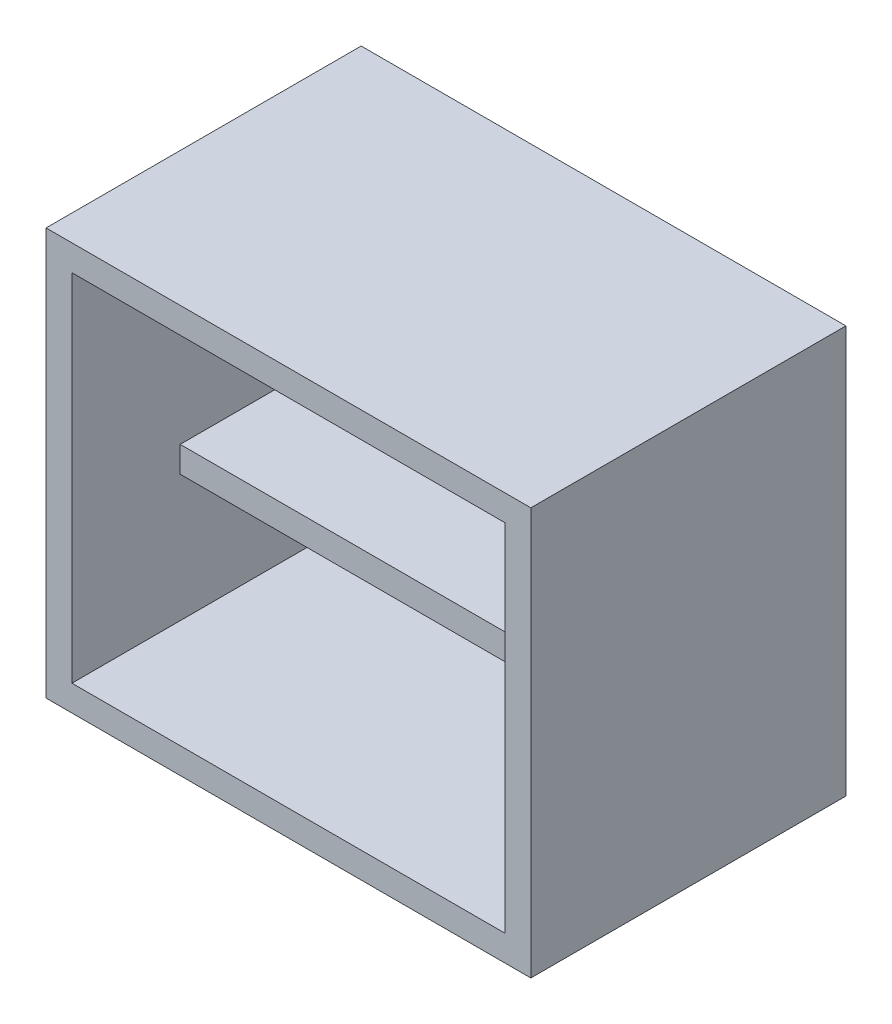
ISO-10303-21;
HEADER;
FILE_DESCRIPTION(('STEP AP214'),'2;1');
FILE_NAME('part.step','',(''),(''),'','','');
FILE_SCHEMA(('AUTOMOTIVE_DESIGN { 1 0 10303 214 1 1 1 1 }'));
ENDSEC;
DATA;
#1=APPLICATION_CONTEXT('core data for automotive mechanical design processes');
#2=APPLICATION_PROTOCOL_DEFINITION('international standard','automotive_design',2000,#1);
#3=PRODUCT_CONTEXT('',#1,'mechanical');
#4=PRODUCT('Part','Part','',(#3));
#5=PRODUCT_RELATED_PRODUCT_CATEGORY('part','',(#4));
#6=PRODUCT_DEFINITION_FORMATION('','',#4);
#7=PRODUCT_DEFINITION_CONTEXT('part definition',#1,'design');
#8=PRODUCT_DEFINITION('design','',#6,#7);
#9=PRODUCT_DEFINITION_SHAPE('','',#8);
#10=(LENGTH_UNIT() NAMED_UNIT(*) SI_UNIT(.MILLI.,.METRE.));
#11=(NAMED_UNIT(*) PLANE_ANGLE_UNIT() SI_UNIT($,.RADIAN.));
#12=(NAMED_UNIT(*) SI_UNIT($,.STERADIAN.) SOLID_ANGLE_UNIT());
#13=UNCERTAINTY_MEASURE_WITH_UNIT(LENGTH_MEASURE(1.E-05),#10,'distance_accuracy_value','');
#14=(GEOMETRIC_REPRESENTATION_CONTEXT(3) GLOBAL_UNCERTAINTY_ASSIGNED_CONTEXT((#13)) GLOBAL_UNIT_ASSIGNED_CONTEXT((#10,
#11,#12)) REPRESENTATION_CONTEXT('',''));
#15=CARTESIAN_POINT('',(0.,0.,0.));
#16=DIRECTION('',(0.,0.,1.));
#17=DIRECTION('',(1.,0.,0.));
#18=AXIS2_PLACEMENT_3D('',#15,#16,#17);
#19=CARTESIAN_POINT('',(0.,110.5,0.));
#20=DIRECTION('',(0.,1.,0.));
#21=DIRECTION('',(0.,0.,1.));
#22=AXIS2_PLACEMENT_3D('',#19,#20,#21);
#23=PLANE('',#22);
#24=DIRECTION('',(0.,0.,1.));
#25=VECTOR('',#24,1.);
#26=CARTESIAN_POINT('',(-134.,110.5,-97.5));
#27=LINE('',#26,#25);
#28=CARTESIAN_POINT('',(-134.,110.5,-97.5));
#29=VERTEX_POINT('',#28);
#30=CARTESIAN_POINT('',(-134.,110.5,30.5));
#31=VERTEX_POINT('',#30);
#32=EDGE_CURVE('E182',#29,#31,#27,.T.);
#33=ORIENTED_EDGE('',*,*,#32,.T.);
#34=DIRECTION('',(1.,0.,0.));
#35=VECTOR('',#34,1.);
#36=CARTESIAN_POINT('',(-134.,110.5,30.5));
#37=LINE('',#36,#35);
#38=CARTESIAN_POINT('',(134.,110.5,30.5));
#39=VERTEX_POINT('',#38);
#40=EDGE_CURVE('E185',#31,#39,#37,.T.);
#41=ORIENTED_EDGE('',*,*,#40,.T.);
#42=DIRECTION('',(0.,0.,-1.));
#43=VECTOR('',#42,1.);
#44=CARTESIAN_POINT('',(134.,110.5,-97.5));
#45=LINE('',#44,#43);
#46=CARTESIAN_POINT('',(134.,110.5,-97.5));
#47=VERTEX_POINT('',#46);
#48=EDGE_CURVE('E189',#39,#47,#45,.T.);
#49=ORIENTED_EDGE('',*,*,#48,.T.);
#50=DIRECTION('',(-1.,0.,0.));
#51=VECTOR('',#50,1.);
#52=CARTESIAN_POINT('',(-134.,110.5,-97.5));
#53=LINE('',#52,#51);
#54=EDGE_CURVE('E192',#47,#29,#53,.T.);
#55=ORIENTED_EDGE('',*,*,#54,.T.);
#56=EDGE_LOOP('',(#33,#41,#49,#55));
#57=FACE_BOUND('',#56,.T.);
#58=DIRECTION('',(-1.,0.,0.));
#59=VECTOR('',#58,1.);
#60=CARTESIAN_POINT('',(31.3688182321278,110.5,-81.9869785387026));
#61=LINE('',#60,#59);
#62=CARTESIAN_POINT('',(31.3688182321278,110.5,-81.9869785387026));
#63=VERTEX_POINT('',#62);
#64=CARTESIAN_POINT('',(-9.63118176787223,110.5,-81.9869785387026));
#65=VERTEX_POINT('',#64);
#66=EDGE_CURVE('E499',#63,#65,#61,.T.);
#67=ORIENTED_EDGE('',*,*,#66,.F.);
#68=DIRECTION('',(0.,0.,-1.));
#69=VECTOR('',#68,1.);
#70=CARTESIAN_POINT('',(31.3688182321278,110.5,-81.9869785387026));
#71=LINE('',#70,#69);
#72=CARTESIAN_POINT('',(31.3688182321278,110.5,-46.9869785387026));
#73=VERTEX_POINT('',#72);
#74=EDGE_CURVE('E173',#73,#63,#71,.T.);
#75=ORIENTED_EDGE('',*,*,#74,.F.);
#76=DIRECTION('',(1.,0.,0.));
#77=VECTOR('',#76,1.);
#78=CARTESIAN_POINT('',(31.3688182321278,110.5,-46.9869785387026));
#79=LINE('',#78,#77);
#80=CARTESIAN_POINT('',(-9.63118176787223,110.5,-46.9869785387026));
#81=VERTEX_POINT('',#80);
#82=EDGE_CURVE('E169',#81,#73,#79,.T.);
#83=ORIENTED_EDGE('',*,*,#82,.F.);
#84=DIRECTION('',(0.,0.,1.));
#85=VECTOR('',#84,1.);
#86=CARTESIAN_POINT('',(-9.63118176787223,110.5,-81.9869785387026));
#87=LINE('',#86,#85);
#88=EDGE_CURVE('E496',#65,#81,#87,.T.);
#89=ORIENTED_EDGE('',*,*,#88,.F.);
#90=EDGE_LOOP('',(#67,#75,#83,#89));
#91=FACE_BOUND('',#90,.T.);
#92=ADVANCED_FACE('F37',(#57,#91),#23,.T.);
#93=CARTESIAN_POINT('',(0.,16.,0.));
#94=DIRECTION('',(0.,-1.,0.));
#95=DIRECTION('',(0.,0.,-1.));
#96=AXIS2_PLACEMENT_3D('',#93,#94,#95);
#97=PLANE('',#96);
#98=DIRECTION('',(0.,0.,1.));
#99=VECTOR('',#98,1.);
#100=CARTESIAN_POINT('',(134.,16.,-97.5));
#101=LINE('',#100,#99);
#102=CARTESIAN_POINT('',(134.,16.,-97.5));
#103=VERTEX_POINT('',#102);
#104=CARTESIAN_POINT('',(134.,16.,97.5));
#105=VERTEX_POINT('',#104);
#106=EDGE_CURVE('E218',#103,#105,#101,.T.);
#107=ORIENTED_EDGE('',*,*,#106,.F.);
#108=DIRECTION('',(-1.,0.,0.));
#109=VECTOR('',#108,1.);
#110=CARTESIAN_POINT('',(-150.,16.,-97.5));
#111=LINE('',#110,#109);
#112=CARTESIAN_POINT('',(-134.,16.,-97.5));
#113=VERTEX_POINT('',#112);
#114=EDGE_CURVE('E248',#103,#113,#111,.T.);
#115=ORIENTED_EDGE('',*,*,#114,.T.);
#116=DIRECTION('',(0.,0.,-1.));
#117=VECTOR('',#116,1.);
#118=CARTESIAN_POINT('',(-134.,16.,-97.5));
#119=LINE('',#118,#117);
#120=CARTESIAN_POINT('',(-134.,16.,97.5));
#121=VERTEX_POINT('',#120);
#122=EDGE_CURVE('E234',#121,#113,#119,.T.);
#123=ORIENTED_EDGE('',*,*,#122,.F.);
#124=DIRECTION('',(1.,0.,0.));
#125=VECTOR('',#124,1.);
#126=CARTESIAN_POINT('',(-150.,16.,97.5));
#127=LINE('',#126,#125);
#128=EDGE_CURVE('E251',#121,#105,#127,.T.);
#129=ORIENTED_EDGE('',*,*,#128,.T.);
#130=EDGE_LOOP('',(#107,#115,#123,#129));
#131=FACE_BOUND('',#130,.T.);
#132=ADVANCED_FACE('F305',(#131),#97,.F.);
#133=CARTESIAN_POINT('',(150.,16.,97.5));
#134=DIRECTION('',(-1.,0.,0.));
#135=DIRECTION('',(0.,0.,1.));
#136=AXIS2_PLACEMENT_3D('',#133,#134,#135);
#137=PLANE('',#136);
#138=DIRECTION('',(0.,0.,-1.));
#139=VECTOR('',#138,1.);
#140=CARTESIAN_POINT('',(150.,0.,97.5));
#141=LINE('',#140,#139);
#142=CARTESIAN_POINT('',(150.,0.,97.5));
#143=VERTEX_POINT('',#142);
#144=CARTESIAN_POINT('',(150.,0.,-97.5));
#145=VERTEX_POINT('',#144);
#146=EDGE_CURVE('E247',#143,#145,#141,.T.);
#147=ORIENTED_EDGE('',*,*,#146,.T.);
#148=DIRECTION('',(0.,-1.,0.));
#149=VECTOR('',#148,1.);
#150=CARTESIAN_POINT('',(150.,16.,-97.5));
#151=LINE('',#150,#149);
#152=CARTESIAN_POINT('',(150.,252.,-97.5));
#153=VERTEX_POINT('',#152);
#154=EDGE_CURVE('E11',#153,#145,#151,.T.);
#155=ORIENTED_EDGE('',*,*,#154,.F.);
#156=DIRECTION('',(0.,0.,-1.));
#157=VECTOR('',#156,1.);
#158=CARTESIAN_POINT('',(150.,252.,-97.5));
#159=LINE('',#158,#157);
#160=CARTESIAN_POINT('',(150.,252.,97.5));
#161=VERTEX_POINT('',#160);
#162=EDGE_CURVE('E212',#161,#153,#159,.T.);
#163=ORIENTED_EDGE('',*,*,#162,.F.);
#164=DIRECTION('',(0.,-1.,0.));
#165=VECTOR('',#164,1.);
#166=CARTESIAN_POINT('',(150.,16.,97.5));
#167=LINE('',#166,#165);
#168=EDGE_CURVE('E254',#161,#143,#167,.T.);
#169=ORIENTED_EDGE('',*,*,#168,.T.);
#170=EDGE_LOOP('',(#147,#155,#163,#169));
#171=FACE_BOUND('',#170,.T.);
#172=ADVANCED_FACE('F39',(#171),#137,.F.);
#173=CARTESIAN_POINT('',(-150.,16.,-97.5));
#174=DIRECTION('',(0.,0.,1.));
#175=DIRECTION('',(1.,0.,0.));
#176=AXIS2_PLACEMENT_3D('',#173,#174,#175);
#177=PLANE('',#176);
#178=DIRECTION('',(-1.,0.,0.));
#179=VECTOR('',#178,1.);
#180=CARTESIAN_POINT('',(-134.,94.5,-97.5));
#181=LINE('',#180,#179);
#182=CARTESIAN_POINT('',(134.,94.5,-97.5));
#183=VERTEX_POINT('',#182);
#184=CARTESIAN_POINT('',(-134.,94.5,-97.5));
#185=VERTEX_POINT('',#184);
#186=EDGE_CURVE('E186',#183,#185,#181,.T.);
#187=ORIENTED_EDGE('',*,*,#186,.T.);
#188=DIRECTION('',(0.,-1.,0.));
#189=VECTOR('',#188,1.);
#190=CARTESIAN_POINT('',(-134.,236.,-97.5));
#191=LINE('',#190,#189);
#192=EDGE_CURVE('E238',#185,#113,#191,.T.);
#193=ORIENTED_EDGE('',*,*,#192,.T.);
#194=ORIENTED_EDGE('',*,*,#114,.F.);
#195=DIRECTION('',(0.,-1.,0.));
#196=VECTOR('',#195,1.);
#197=CARTESIAN_POINT('',(134.,236.,-97.5));
#198=LINE('',#197,#196);
#199=EDGE_CURVE('E231',#183,#103,#198,.T.);
#200=ORIENTED_EDGE('',*,*,#199,.F.);
#201=EDGE_LOOP('',(#187,#193,#194,#200));
#202=FACE_BOUND('',#201,.T.);
#203=DIRECTION('',(0.,-1.,0.));
#204=VECTOR('',#203,1.);
#205=CARTESIAN_POINT('',(-150.,16.,-97.5));
#206=LINE('',#205,#204);
#207=CARTESIAN_POINT('',(-150.,252.,-97.5));
#208=VERTEX_POINT('',#207);
#209=CARTESIAN_POINT('',(-150.,0.,-97.5));
#210=VERTEX_POINT('',#209);
#211=EDGE_CURVE('E45',#208,#210,#206,.T.);
#212=ORIENTED_EDGE('',*,*,#211,.F.);
#213=DIRECTION('',(-1.,0.,0.));
#214=VECTOR('',#213,1.);
#215=CARTESIAN_POINT('',(-150.,252.,-97.5));
#216=LINE('',#215,#214);
#217=EDGE_CURVE('E215',#153,#208,#216,.T.);
#218=ORIENTED_EDGE('',*,*,#217,.F.);
#219=ORIENTED_EDGE('',*,*,#154,.T.);
#220=DIRECTION('',(-1.,0.,0.));
#221=VECTOR('',#220,1.);
#222=CARTESIAN_POINT('',(-150.,0.,-97.5));
#223=LINE('',#222,#221);
#224=EDGE_CURVE('E257',#145,#210,#223,.T.);
#225=ORIENTED_EDGE('',*,*,#224,.T.);
#226=EDGE_LOOP('',(#212,#218,#219,#225));
#227=FACE_BOUND('',#226,.T.);
#228=DIRECTION('',(-1.,0.,0.));
#229=VECTOR('',#228,1.);
#230=CARTESIAN_POINT('',(-150.,236.,-97.5));
#231=LINE('',#230,#229);
#232=CARTESIAN_POINT('',(134.,236.,-97.5));
#233=VERTEX_POINT('',#232);
#234=CARTESIAN_POINT('',(-134.,236.,-97.5));
#235=VERTEX_POINT('',#234);
#236=EDGE_CURVE('E209',#233,#235,#231,.T.);
#237=ORIENTED_EDGE('',*,*,#236,.T.);
#238=EDGE_CURVE('E241',#235,#29,#191,.T.);
#239=ORIENTED_EDGE('',*,*,#238,.T.);
#240=ORIENTED_EDGE('',*,*,#54,.F.);
#241=EDGE_CURVE('E232',#233,#47,#198,.T.);
#242=ORIENTED_EDGE('',*,*,#241,.F.);
#243=EDGE_LOOP('',(#237,#239,#240,#242));
#244=FACE_BOUND('',#243,.T.);
#245=ADVANCED_FACE('F284',(#202,#227,#244),#177,.F.);
#246=CARTESIAN_POINT('',(-150.,16.,97.5));
#247=DIRECTION('',(1.,0.,0.));
#248=DIRECTION('',(0.,0.,-1.));
#249=AXIS2_PLACEMENT_3D('',#246,#247,#248);
#250=PLANE('',#249);
#251=DIRECTION('',(0.,0.,1.));
#252=VECTOR('',#251,1.);
#253=CARTESIAN_POINT('',(-150.,0.,97.5));
#254=LINE('',#253,#252);
#255=CARTESIAN_POINT('',(-150.,0.,97.5));
#256=VERTEX_POINT('',#255);
#257=EDGE_CURVE('E259',#210,#256,#254,.T.);
#258=ORIENTED_EDGE('',*,*,#257,.T.);
#259=DIRECTION('',(0.,-1.,0.));
#260=VECTOR('',#259,1.);
#261=CARTESIAN_POINT('',(-150.,16.,97.5));
#262=LINE('',#261,#260);
#263=CARTESIAN_POINT('',(-150.,252.,97.5));
#264=VERTEX_POINT('',#263);
#265=EDGE_CURVE('E264',#264,#256,#262,.T.);
#266=ORIENTED_EDGE('',*,*,#265,.F.);
#267=DIRECTION('',(0.,0.,1.));
#268=VECTOR('',#267,1.);
#269=CARTESIAN_POINT('',(-150.,252.,-97.5));
#270=LINE('',#269,#268);
#271=EDGE_CURVE('E205',#208,#264,#270,.T.);
#272=ORIENTED_EDGE('',*,*,#271,.F.);
#273=ORIENTED_EDGE('',*,*,#211,.T.);
#274=EDGE_LOOP('',(#258,#266,#272,#273));
#275=FACE_BOUND('',#274,.T.);
#276=ADVANCED_FACE('F270',(#275),#250,.F.);
#277=CARTESIAN_POINT('',(-150.,16.,97.5));
#278=DIRECTION('',(0.,0.,-1.));
#279=DIRECTION('',(-1.,0.,0.));
#280=AXIS2_PLACEMENT_3D('',#277,#278,#279);
#281=PLANE('',#280);
#282=DIRECTION('',(0.,-1.,0.));
#283=VECTOR('',#282,1.);
#284=CARTESIAN_POINT('',(-134.,236.,97.5));
#285=LINE('',#284,#283);
#286=CARTESIAN_POINT('',(-134.,236.,97.5));
#287=VERTEX_POINT('',#286);
#288=EDGE_CURVE('E244',#287,#121,#285,.T.);
#289=ORIENTED_EDGE('',*,*,#288,.F.);
#290=DIRECTION('',(1.,0.,0.));
#291=VECTOR('',#290,1.);
#292=CARTESIAN_POINT('',(-150.,236.,97.5));
#293=LINE('',#292,#291);
#294=CARTESIAN_POINT('',(134.,236.,97.5));
#295=VERTEX_POINT('',#294);
#296=EDGE_CURVE('E204',#287,#295,#293,.T.);
#297=ORIENTED_EDGE('',*,*,#296,.T.);
#298=DIRECTION('',(0.,-1.,0.));
#299=VECTOR('',#298,1.);
#300=CARTESIAN_POINT('',(134.,236.,97.5));
#301=LINE('',#300,#299);
#302=EDGE_CURVE('E226',#295,#105,#301,.T.);
#303=ORIENTED_EDGE('',*,*,#302,.T.);
#304=ORIENTED_EDGE('',*,*,#128,.F.);
#305=EDGE_LOOP('',(#289,#297,#303,#304));
#306=FACE_BOUND('',#305,.T.);
#307=DIRECTION('',(1.,0.,0.));
#308=VECTOR('',#307,1.);
#309=CARTESIAN_POINT('',(-150.,0.,97.5));
#310=LINE('',#309,#308);
#311=EDGE_CURVE('E252',#256,#143,#310,.T.);
#312=ORIENTED_EDGE('',*,*,#311,.T.);
#313=ORIENTED_EDGE('',*,*,#168,.F.);
#314=DIRECTION('',(1.,0.,0.));
#315=VECTOR('',#314,1.);
#316=CARTESIAN_POINT('',(-150.,252.,97.5));
#317=LINE('',#316,#315);
#318=EDGE_CURVE('E208',#264,#161,#317,.T.);
#319=ORIENTED_EDGE('',*,*,#318,.F.);
#320=ORIENTED_EDGE('',*,*,#265,.T.);
#321=EDGE_LOOP('',(#312,#313,#319,#320));
#322=FACE_BOUND('',#321,.T.);
#323=ADVANCED_FACE('F278',(#306,#322),#281,.F.);
#324=CARTESIAN_POINT('',(0.,0.,0.));
#325=DIRECTION('',(0.,-1.,0.));
#326=DIRECTION('',(0.,0.,-1.));
#327=AXIS2_PLACEMENT_3D('',#324,#325,#326);
#328=PLANE('',#327);
#329=ORIENTED_EDGE('',*,*,#146,.F.);
#330=ORIENTED_EDGE('',*,*,#311,.F.);
#331=ORIENTED_EDGE('',*,*,#257,.F.);
#332=ORIENTED_EDGE('',*,*,#224,.F.);
#333=EDGE_LOOP('',(#329,#330,#331,#332));
#334=FACE_BOUND('',#333,.T.);
#335=ADVANCED_FACE('F276',(#334),#328,.T.);
#336=CARTESIAN_POINT('',(-134.,236.,-97.5));
#337=DIRECTION('',(-1.,0.,0.));
#338=DIRECTION('',(0.,0.,1.));
#339=AXIS2_PLACEMENT_3D('',#336,#337,#338);
#340=PLANE('',#339);
#341=DIRECTION('',(0.,-1.,0.));
#342=VECTOR('',#341,1.);
#343=CARTESIAN_POINT('',(-134.,110.5,30.5));
#344=LINE('',#343,#342);
#345=CARTESIAN_POINT('',(-134.,94.5,30.5));
#346=VERTEX_POINT('',#345);
#347=EDGE_CURVE('E60',#31,#346,#344,.T.);
#348=ORIENTED_EDGE('',*,*,#347,.F.);
#349=ORIENTED_EDGE('',*,*,#32,.F.);
#350=ORIENTED_EDGE('',*,*,#238,.F.);
#351=DIRECTION('',(0.,0.,-1.));
#352=VECTOR('',#351,1.);
#353=CARTESIAN_POINT('',(-134.,236.,-97.5));
#354=LINE('',#353,#352);
#355=EDGE_CURVE('E235',#287,#235,#354,.T.);
#356=ORIENTED_EDGE('',*,*,#355,.F.);
#357=ORIENTED_EDGE('',*,*,#288,.T.);
#358=ORIENTED_EDGE('',*,*,#122,.T.);
#359=ORIENTED_EDGE('',*,*,#192,.F.);
#360=DIRECTION('',(0.,0.,1.));
#361=VECTOR('',#360,1.);
#362=CARTESIAN_POINT('',(-134.,94.5,-97.5));
#363=LINE('',#362,#361);
#364=EDGE_CURVE('E175',#185,#346,#363,.T.);
#365=ORIENTED_EDGE('',*,*,#364,.T.);
#366=EDGE_LOOP('',(#348,#349,#350,#356,#357,#358,#359,#365));
#367=FACE_BOUND('',#366,.T.);
#368=ADVANCED_FACE('F295',(#367),#340,.F.);
#369=CARTESIAN_POINT('',(134.,236.,-97.5));
#370=DIRECTION('',(1.,0.,0.));
#371=DIRECTION('',(0.,0.,-1.));
#372=AXIS2_PLACEMENT_3D('',#369,#370,#371);
#373=PLANE('',#372);
#374=ORIENTED_EDGE('',*,*,#241,.T.);
#375=ORIENTED_EDGE('',*,*,#48,.F.);
#376=DIRECTION('',(0.,-1.,0.));
#377=VECTOR('',#376,1.);
#378=CARTESIAN_POINT('',(134.,110.5,30.5));
#379=LINE('',#378,#377);
#380=CARTESIAN_POINT('',(134.,94.5,30.5));
#381=VERTEX_POINT('',#380);
#382=EDGE_CURVE('E194',#39,#381,#379,.T.);
#383=ORIENTED_EDGE('',*,*,#382,.T.);
#384=DIRECTION('',(0.,0.,-1.));
#385=VECTOR('',#384,1.);
#386=CARTESIAN_POINT('',(134.,94.5,-97.5));
#387=LINE('',#386,#385);
#388=EDGE_CURVE('E198',#381,#183,#387,.T.);
#389=ORIENTED_EDGE('',*,*,#388,.T.);
#390=ORIENTED_EDGE('',*,*,#199,.T.);
#391=ORIENTED_EDGE('',*,*,#106,.T.);
#392=ORIENTED_EDGE('',*,*,#302,.F.);
#393=DIRECTION('',(0.,0.,1.));
#394=VECTOR('',#393,1.);
#395=CARTESIAN_POINT('',(134.,236.,-97.5));
#396=LINE('',#395,#394);
#397=EDGE_CURVE('E223',#233,#295,#396,.T.);
#398=ORIENTED_EDGE('',*,*,#397,.F.);
#399=EDGE_LOOP('',(#374,#375,#383,#389,#390,#391,#392,#398));
#400=FACE_BOUND('',#399,.T.);
#401=ADVANCED_FACE('F300',(#400),#373,.F.);
#402=CARTESIAN_POINT('',(0.,236.,0.));
#403=DIRECTION('',(0.,1.,0.));
#404=DIRECTION('',(0.,0.,1.));
#405=AXIS2_PLACEMENT_3D('',#402,#403,#404);
#406=PLANE('',#405);
#407=ORIENTED_EDGE('',*,*,#296,.F.);
#408=ORIENTED_EDGE('',*,*,#355,.T.);
#409=ORIENTED_EDGE('',*,*,#236,.F.);
#410=ORIENTED_EDGE('',*,*,#397,.T.);
#411=EDGE_LOOP('',(#407,#408,#409,#410));
#412=FACE_BOUND('',#411,.T.);
#413=ADVANCED_FACE('F293',(#412),#406,.F.);
#414=CARTESIAN_POINT('',(0.,252.,0.));
#415=DIRECTION('',(0.,1.,0.));
#416=DIRECTION('',(0.,0.,1.));
#417=AXIS2_PLACEMENT_3D('',#414,#415,#416);
#418=PLANE('',#417);
#419=ORIENTED_EDGE('',*,*,#271,.T.);
#420=ORIENTED_EDGE('',*,*,#318,.T.);
#421=ORIENTED_EDGE('',*,*,#162,.T.);
#422=ORIENTED_EDGE('',*,*,#217,.T.);
#423=EDGE_LOOP('',(#419,#420,#421,#422));
#424=FACE_BOUND('',#423,.T.);
#425=ADVANCED_FACE('F283',(#424),#418,.T.);
#426=CARTESIAN_POINT('',(-134.,110.5,30.5));
#427=DIRECTION('',(0.,0.,-1.));
#428=DIRECTION('',(-1.,0.,0.));
#429=AXIS2_PLACEMENT_3D('',#426,#427,#428);
#430=PLANE('',#429);
#431=DIRECTION('',(1.,0.,0.));
#432=VECTOR('',#431,1.);
#433=CARTESIAN_POINT('',(-134.,94.5,30.5));
#434=LINE('',#433,#432);
#435=EDGE_CURVE('E177',#346,#381,#434,.T.);
#436=ORIENTED_EDGE('',*,*,#435,.T.);
#437=ORIENTED_EDGE('',*,*,#382,.F.);
#438=ORIENTED_EDGE('',*,*,#40,.F.);
#439=ORIENTED_EDGE('',*,*,#347,.T.);
#440=EDGE_LOOP('',(#436,#437,#438,#439));
#441=FACE_BOUND('',#440,.T.);
#442=ADVANCED_FACE('F315',(#441),#430,.F.);
#443=CARTESIAN_POINT('',(0.,94.5,0.));
#444=DIRECTION('',(0.,1.,0.));
#445=DIRECTION('',(0.,0.,1.));
#446=AXIS2_PLACEMENT_3D('',#443,#444,#445);
#447=PLANE('',#446);
#448=ORIENTED_EDGE('',*,*,#364,.F.);
#449=ORIENTED_EDGE('',*,*,#186,.F.);
#450=ORIENTED_EDGE('',*,*,#388,.F.);
#451=ORIENTED_EDGE('',*,*,#435,.F.);
#452=EDGE_LOOP('',(#448,#449,#450,#451));
#453=FACE_BOUND('',#452,.T.);
#454=ADVANCED_FACE('F313',(#453),#447,.F.);
#455=CARTESIAN_POINT('',(31.3688182321278,130.5,-81.9869785387026));
#456=DIRECTION('',(-1.,0.,0.));
#457=DIRECTION('',(0.,0.,1.));
#458=AXIS2_PLACEMENT_3D('',#455,#456,#457);
#459=PLANE('',#458);
#460=ORIENTED_EDGE('',*,*,#74,.T.);
#461=DIRECTION('',(0.,-1.,0.));
#462=VECTOR('',#461,1.);
#463=CARTESIAN_POINT('',(31.3688182321278,130.5,-81.9869785387026));
#464=LINE('',#463,#462);
#465=CARTESIAN_POINT('',(31.3688182321278,130.5,-81.9869785387026));
#466=VERTEX_POINT('',#465);
#467=EDGE_CURVE('E154',#466,#63,#464,.T.);
#468=ORIENTED_EDGE('',*,*,#467,.F.);
#469=DIRECTION('',(0.,0.,-1.));
#470=VECTOR('',#469,1.);
#471=CARTESIAN_POINT('',(31.3688182321278,130.5,-81.9869785387026));
#472=LINE('',#471,#470);
#473=CARTESIAN_POINT('',(31.3688182321278,130.5,-46.9869785387026));
#474=VERTEX_POINT('',#473);
#475=EDGE_CURVE('E161',#474,#466,#472,.T.);
#476=ORIENTED_EDGE('',*,*,#475,.F.);
#477=DIRECTION('',(0.,-1.,0.));
#478=VECTOR('',#477,1.);
#479=CARTESIAN_POINT('',(31.3688182321278,130.5,-46.9869785387026));
#480=LINE('',#479,#478);
#481=EDGE_CURVE('E494',#474,#73,#480,.T.);
#482=ORIENTED_EDGE('',*,*,#481,.T.);
#483=EDGE_LOOP('',(#460,#468,#476,#482));
#484=FACE_BOUND('',#483,.T.);
#485=ADVANCED_FACE('F171',(#484),#459,.F.);
#486=CARTESIAN_POINT('',(31.3688182321278,130.5,-81.9869785387026));
#487=DIRECTION('',(0.,0.,1.));
#488=DIRECTION('',(1.,0.,0.));
#489=AXIS2_PLACEMENT_3D('',#486,#487,#488);
#490=PLANE('',#489);
#491=ORIENTED_EDGE('',*,*,#66,.T.);
#492=DIRECTION('',(0.,-1.,0.));
#493=VECTOR('',#492,1.);
#494=CARTESIAN_POINT('',(-9.63118176787223,130.5,-81.9869785387026));
#495=LINE('',#494,#493);
#496=CARTESIAN_POINT('',(-9.63118176787223,130.5,-81.9869785387026));
#497=VERTEX_POINT('',#496);
#498=EDGE_CURVE('E157',#497,#65,#495,.T.);
#499=ORIENTED_EDGE('',*,*,#498,.F.);
#500=DIRECTION('',(-1.,0.,0.));
#501=VECTOR('',#500,1.);
#502=CARTESIAN_POINT('',(31.3688182321278,130.5,-81.9869785387026));
#503=LINE('',#502,#501);
#504=EDGE_CURVE('E150',#466,#497,#503,.T.);
#505=ORIENTED_EDGE('',*,*,#504,.F.);
#506=ORIENTED_EDGE('',*,*,#467,.T.);
#507=EDGE_LOOP('',(#491,#499,#505,#506));
#508=FACE_BOUND('',#507,.T.);
#509=ADVANCED_FACE('F152',(#508),#490,.F.);
#510=CARTESIAN_POINT('',(-9.63118176787223,130.5,-81.9869785387026));
#511=DIRECTION('',(1.,0.,0.));
#512=DIRECTION('',(0.,0.,-1.));
#513=AXIS2_PLACEMENT_3D('',#510,#511,#512);
#514=PLANE('',#513);
#515=ORIENTED_EDGE('',*,*,#88,.T.);
#516=DIRECTION('',(0.,-1.,0.));
#517=VECTOR('',#516,1.);
#518=CARTESIAN_POINT('',(-9.63118176787223,130.5,-46.9869785387026));
#519=LINE('',#518,#517);
#520=CARTESIAN_POINT('',(-9.63118176787223,130.5,-46.9869785387026));
#521=VERTEX_POINT('',#520);
#522=EDGE_CURVE('E52',#521,#81,#519,.T.);
#523=ORIENTED_EDGE('',*,*,#522,.F.);
#524=DIRECTION('',(0.,0.,1.));
#525=VECTOR('',#524,1.);
#526=CARTESIAN_POINT('',(-9.63118176787223,130.5,-81.9869785387026));
#527=LINE('',#526,#525);
#528=EDGE_CURVE('E160',#497,#521,#527,.T.);
#529=ORIENTED_EDGE('',*,*,#528,.F.);
#530=ORIENTED_EDGE('',*,*,#498,.T.);
#531=EDGE_LOOP('',(#515,#523,#529,#530));
#532=FACE_BOUND('',#531,.T.);
#533=ADVANCED_FACE('F335',(#532),#514,.F.);
#534=CARTESIAN_POINT('',(31.3688182321278,130.5,-46.9869785387026));
#535=DIRECTION('',(0.,0.,-1.));
#536=DIRECTION('',(-1.,0.,0.));
#537=AXIS2_PLACEMENT_3D('',#534,#535,#536);
#538=PLANE('',#537);
#539=ORIENTED_EDGE('',*,*,#82,.T.);
#540=ORIENTED_EDGE('',*,*,#481,.F.);
#541=DIRECTION('',(1.,0.,0.));
#542=VECTOR('',#541,1.);
#543=CARTESIAN_POINT('',(31.3688182321278,130.5,-46.9869785387026));
#544=LINE('',#543,#542);
#545=EDGE_CURVE('E165',#521,#474,#544,.T.);
#546=ORIENTED_EDGE('',*,*,#545,.F.);
#547=ORIENTED_EDGE('',*,*,#522,.T.);
#548=EDGE_LOOP('',(#539,#540,#546,#547));
#549=FACE_BOUND('',#548,.T.);
#550=ADVANCED_FACE('F338',(#549),#538,.F.);
#551=CARTESIAN_POINT('',(0.,130.5,0.));
#552=DIRECTION('',(0.,-1.,0.));
#553=DIRECTION('',(0.,0.,-1.));
#554=AXIS2_PLACEMENT_3D('',#551,#552,#553);
#555=PLANE('',#554);
#556=ORIENTED_EDGE('',*,*,#475,.T.);
#557=ORIENTED_EDGE('',*,*,#504,.T.);
#558=ORIENTED_EDGE('',*,*,#528,.T.);
#559=ORIENTED_EDGE('',*,*,#545,.T.);
#560=EDGE_LOOP('',(#556,#557,#558,#559));
#561=FACE_BOUND('',#560,.T.);
#562=ADVANCED_FACE('F164',(#561),#555,.F.);
#563=CLOSED_SHELL('',(#92,#132,#172,#245,#276,#323,#335,#368,#401,#413,#425,#442,#454,#485,#509,
#533,#550,#562));
#564=MANIFOLD_SOLID_BREP('B2',#563);
#565=ADVANCED_BREP_SHAPE_REPRESENTATION('',(#18,#564),#14);
#566=SHAPE_DEFINITION_REPRESENTATION(#9,#565);
ENDSEC;
END-ISO-10303-21;
